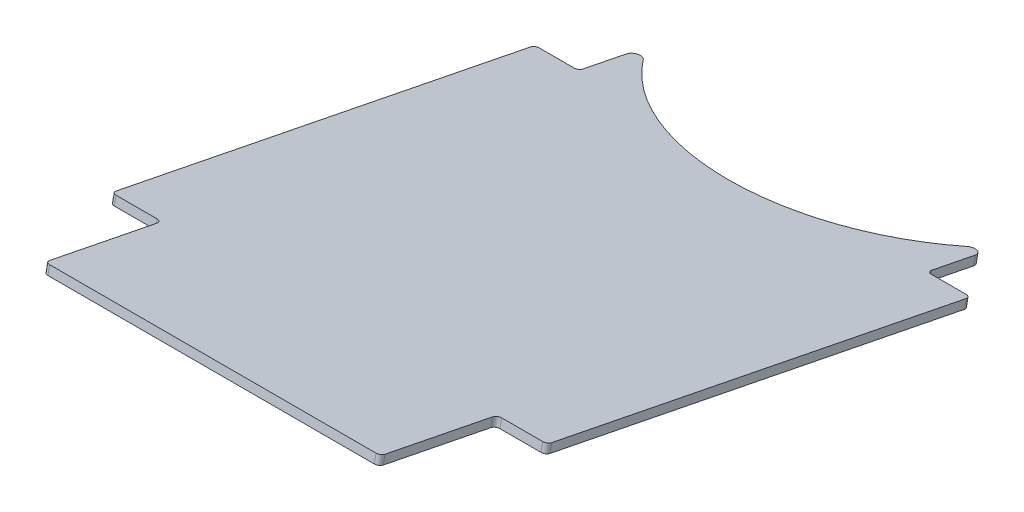
ISO-10303-21;
HEADER;
FILE_DESCRIPTION(('STEP AP214'),'2;1');
FILE_NAME('part.step','',(''),(''),'','','');
FILE_SCHEMA(('AUTOMOTIVE_DESIGN { 1 0 10303 214 1 1 1 1 }'));
ENDSEC;
DATA;
#1=APPLICATION_CONTEXT('core data for automotive mechanical design processes');
#2=APPLICATION_PROTOCOL_DEFINITION('international standard','automotive_design',2000,#1);
#3=PRODUCT_CONTEXT('',#1,'mechanical');
#4=PRODUCT('Part','Part','',(#3));
#5=PRODUCT_RELATED_PRODUCT_CATEGORY('part','',(#4));
#6=PRODUCT_DEFINITION_FORMATION('','',#4);
#7=PRODUCT_DEFINITION_CONTEXT('part definition',#1,'design');
#8=PRODUCT_DEFINITION('design','',#6,#7);
#9=PRODUCT_DEFINITION_SHAPE('','',#8);
#10=(LENGTH_UNIT() NAMED_UNIT(*) SI_UNIT(.MILLI.,.METRE.));
#11=(NAMED_UNIT(*) PLANE_ANGLE_UNIT() SI_UNIT($,.RADIAN.));
#12=(NAMED_UNIT(*) SI_UNIT($,.STERADIAN.) SOLID_ANGLE_UNIT());
#13=UNCERTAINTY_MEASURE_WITH_UNIT(LENGTH_MEASURE(1.E-05),#10,'distance_accuracy_value','');
#14=(GEOMETRIC_REPRESENTATION_CONTEXT(3) GLOBAL_UNCERTAINTY_ASSIGNED_CONTEXT((#13)) GLOBAL_UNIT_ASSIGNED_CONTEXT((#10,
#11,#12)) REPRESENTATION_CONTEXT('',''));
#15=CARTESIAN_POINT('',(0.,0.,0.));
#16=DIRECTION('',(0.,0.,1.));
#17=DIRECTION('',(1.,0.,0.));
#18=AXIS2_PLACEMENT_3D('',#15,#16,#17);
#19=CARTESIAN_POINT('',(317.5,38.1,0.));
#20=DIRECTION('',(0.,-0.980785280403232,0.195090322016121));
#21=DIRECTION('',(0.,-0.195090322016121,-0.980785280403232));
#22=AXIS2_PLACEMENT_3D('',#19,#20,#21);
#23=PLANE('',#22);
#24=DIRECTION('',(1.,0.,0.));
#25=VECTOR('',#24,1.);
#26=CARTESIAN_POINT('',(31.75,51.896948909235,69.3619461222421));
#27=LINE('',#26,#25);
#28=CARTESIAN_POINT('',(3.302,51.896948909235,69.3619461222421));
#29=VERTEX_POINT('',#28);
#30=CARTESIAN_POINT('',(28.448,51.896948909235,69.3619461222421));
#31=VERTEX_POINT('',#30);
#32=EDGE_CURVE('E338',#29,#31,#27,.T.);
#33=ORIENTED_EDGE('',*,*,#32,.F.);
#34=CARTESIAN_POINT('',(3.302,52.5411371525322,72.6004991181335));
#35=DIRECTION('',(0.,-0.980785280403232,0.195090322016121));
#36=DIRECTION('',(0.,-0.195090322016121,-0.980785280403232));
#37=AXIS2_PLACEMENT_3D('',#34,#35,#36);
#38=CIRCLE('',#37,3.302);
#39=CARTESIAN_POINT('',(0.,52.5411371525322,72.6004991181335));
#40=VERTEX_POINT('',#39);
#41=EDGE_CURVE('E285',#29,#40,#38,.F.);
#42=ORIENTED_EDGE('',*,*,#41,.T.);
#43=DIRECTION('',(0.,0.195090322016121,0.980785280403232));
#44=VECTOR('',#43,1.);
#45=CARTESIAN_POINT('',(0.,38.1,0.));
#46=LINE('',#45,#44);
#47=CARTESIAN_POINT('',(0.,112.622011955949,374.647453738828));
#48=VERTEX_POINT('',#47);
#49=EDGE_CURVE('E231',#40,#48,#46,.T.);
#50=ORIENTED_EDGE('',*,*,#49,.T.);
#51=CARTESIAN_POINT('',(3.302,112.622011955949,374.647453738828));
#52=DIRECTION('',(0.,-0.980785280403232,0.195090322016121));
#53=DIRECTION('',(0.,-0.195090322016121,-0.980785280403232));
#54=AXIS2_PLACEMENT_3D('',#51,#52,#53);
#55=CIRCLE('',#54,3.302);
#56=CARTESIAN_POINT('',(3.302,113.266200199246,377.88600673472));
#57=VERTEX_POINT('',#56);
#58=EDGE_CURVE('E283',#48,#57,#55,.F.);
#59=ORIENTED_EDGE('',*,*,#58,.T.);
#60=DIRECTION('',(-1.,0.,0.));
#61=VECTOR('',#60,1.);
#62=CARTESIAN_POINT('',(0.,113.266200199246,377.88600673472));
#63=LINE('',#62,#61);
#64=CARTESIAN_POINT('',(33.2105,113.266200199246,377.88600673472));
#65=VERTEX_POINT('',#64);
#66=EDGE_CURVE('E349',#65,#57,#63,.T.);
#67=ORIENTED_EDGE('',*,*,#66,.F.);
#68=CARTESIAN_POINT('',(33.2105,113.910388442543,381.124559730611));
#69=DIRECTION('',(0.,-0.980785280403232,0.195090322016121));
#70=DIRECTION('',(0.,-0.195090322016121,-0.980785280403232));
#71=AXIS2_PLACEMENT_3D('',#68,#69,#70);
#72=CIRCLE('',#71,3.302);
#73=CARTESIAN_POINT('',(36.5125,113.910388442543,381.124559730611));
#74=VERTEX_POINT('',#73);
#75=EDGE_CURVE('E325',#65,#74,#72,.T.);
#76=ORIENTED_EDGE('',*,*,#75,.T.);
#77=DIRECTION('',(0.,-0.195090322016121,-0.980785280403232));
#78=VECTOR('',#77,1.);
#79=CARTESIAN_POINT('',(36.5125,113.266200199246,377.88600673472));
#80=LINE('',#79,#78);
#81=CARTESIAN_POINT('',(36.5125,129.516019727189,459.579366187472));
#82=VERTEX_POINT('',#81);
#83=EDGE_CURVE('E406',#82,#74,#80,.T.);
#84=ORIENTED_EDGE('',*,*,#83,.F.);
#85=CARTESIAN_POINT('',(39.8145,129.516019727189,459.579366187472));
#86=DIRECTION('',(0.,-0.980785280403232,0.195090322016121));
#87=DIRECTION('',(0.,-0.195090322016121,-0.980785280403232));
#88=AXIS2_PLACEMENT_3D('',#85,#86,#87);
#89=CIRCLE('',#88,3.302);
#90=CARTESIAN_POINT('',(39.8145,130.160207970487,462.817919183363));
#91=VERTEX_POINT('',#90);
#92=EDGE_CURVE('E281',#82,#91,#89,.F.);
#93=ORIENTED_EDGE('',*,*,#92,.T.);
#94=DIRECTION('',(1.,0.,0.));
#95=VECTOR('',#94,1.);
#96=CARTESIAN_POINT('',(36.5125,130.160207970487,462.817919183363));
#97=LINE('',#96,#95);
#98=CARTESIAN_POINT('',(277.6855,130.160207970487,462.817919183363));
#99=VERTEX_POINT('',#98);
#100=EDGE_CURVE('E397',#91,#99,#97,.T.);
#101=ORIENTED_EDGE('',*,*,#100,.T.);
#102=CARTESIAN_POINT('',(277.6855,129.516019727189,459.579366187472));
#103=DIRECTION('',(0.,-0.980785280403232,0.195090322016121));
#104=DIRECTION('',(0.,-0.195090322016121,-0.980785280403232));
#105=AXIS2_PLACEMENT_3D('',#102,#103,#104);
#106=CIRCLE('',#105,3.302);
#107=CARTESIAN_POINT('',(280.9875,129.51601972719,459.579366187472));
#108=VERTEX_POINT('',#107);
#109=EDGE_CURVE('E279',#99,#108,#106,.F.);
#110=ORIENTED_EDGE('',*,*,#109,.T.);
#111=DIRECTION('',(0.,0.195090322016122,0.980785280403232));
#112=VECTOR('',#111,1.);
#113=CARTESIAN_POINT('',(280.9875,113.266200199246,377.88600673472));
#114=LINE('',#113,#112);
#115=CARTESIAN_POINT('',(280.9875,113.910388442543,381.124559730611));
#116=VERTEX_POINT('',#115);
#117=EDGE_CURVE('E392',#116,#108,#114,.T.);
#118=ORIENTED_EDGE('',*,*,#117,.F.);
#119=CARTESIAN_POINT('',(284.2895,113.910388442543,381.124559730611));
#120=DIRECTION('',(0.,-0.980785280403232,0.195090322016121));
#121=DIRECTION('',(0.,-0.195090322016121,-0.980785280403232));
#122=AXIS2_PLACEMENT_3D('',#119,#120,#121);
#123=CIRCLE('',#122,3.302);
#124=CARTESIAN_POINT('',(284.2895,113.266200199246,377.88600673472));
#125=VERTEX_POINT('',#124);
#126=EDGE_CURVE('E329',#116,#125,#123,.T.);
#127=ORIENTED_EDGE('',*,*,#126,.T.);
#128=DIRECTION('',(-1.,0.,0.));
#129=VECTOR('',#128,1.);
#130=CARTESIAN_POINT('',(317.5,113.266200199246,377.88600673472));
#131=LINE('',#130,#129);
#132=CARTESIAN_POINT('',(314.198,113.266200199246,377.88600673472));
#133=VERTEX_POINT('',#132);
#134=EDGE_CURVE('E391',#133,#125,#131,.T.);
#135=ORIENTED_EDGE('',*,*,#134,.F.);
#136=CARTESIAN_POINT('',(314.198,112.622011955949,374.647453738828));
#137=DIRECTION('',(0.,-0.980785280403232,0.195090322016121));
#138=DIRECTION('',(0.,-0.195090322016121,-0.980785280403232));
#139=AXIS2_PLACEMENT_3D('',#136,#137,#138);
#140=CIRCLE('',#139,3.302);
#141=CARTESIAN_POINT('',(317.5,112.622011955949,374.647453738828));
#142=VERTEX_POINT('',#141);
#143=EDGE_CURVE('E277',#133,#142,#140,.F.);
#144=ORIENTED_EDGE('',*,*,#143,.T.);
#145=DIRECTION('',(0.,0.195090322016121,0.980785280403232));
#146=VECTOR('',#145,1.);
#147=CARTESIAN_POINT('',(317.5,38.1,0.));
#148=LINE('',#147,#146);
#149=CARTESIAN_POINT('',(317.5,52.5411371525322,72.6004991181335));
#150=VERTEX_POINT('',#149);
#151=EDGE_CURVE('E365',#150,#142,#148,.T.);
#152=ORIENTED_EDGE('',*,*,#151,.F.);
#153=CARTESIAN_POINT('',(314.198,52.5411371525322,72.6004991181335));
#154=DIRECTION('',(0.,-0.980785280403232,0.195090322016121));
#155=DIRECTION('',(0.,-0.195090322016121,-0.980785280403232));
#156=AXIS2_PLACEMENT_3D('',#153,#154,#155);
#157=CIRCLE('',#156,3.302);
#158=CARTESIAN_POINT('',(314.198,51.896948909235,69.361946122242));
#159=VERTEX_POINT('',#158);
#160=EDGE_CURVE('E61',#150,#159,#157,.F.);
#161=ORIENTED_EDGE('',*,*,#160,.T.);
#162=DIRECTION('',(1.,0.,0.));
#163=VECTOR('',#162,1.);
#164=CARTESIAN_POINT('',(285.75,51.896948909235,69.3619461222421));
#165=LINE('',#164,#163);
#166=CARTESIAN_POINT('',(289.052,51.896948909235,69.3619461222421));
#167=VERTEX_POINT('',#166);
#168=EDGE_CURVE('E409',#167,#159,#165,.T.);
#169=ORIENTED_EDGE('',*,*,#168,.F.);
#170=CARTESIAN_POINT('',(289.052,51.2527606659377,66.1233931263506));
#171=DIRECTION('',(0.,-0.980785280403232,0.195090322016121));
#172=DIRECTION('',(0.,-0.195090322016121,-0.980785280403232));
#173=AXIS2_PLACEMENT_3D('',#170,#171,#172);
#174=CIRCLE('',#173,3.302);
#175=CARTESIAN_POINT('',(285.75,51.2527606659378,66.1233931263506));
#176=VERTEX_POINT('',#175);
#177=EDGE_CURVE('E69',#167,#176,#174,.T.);
#178=ORIENTED_EDGE('',*,*,#177,.T.);
#179=DIRECTION('',(0.,0.195090322016122,0.980785280403232));
#180=VECTOR('',#179,1.);
#181=CARTESIAN_POINT('',(285.75,38.1,0.));
#182=LINE('',#181,#180);
#183=CARTESIAN_POINT('',(285.75,44.922985203387,34.301462967179));
#184=VERTEX_POINT('',#183);
#185=EDGE_CURVE('E399',#184,#176,#182,.T.);
#186=ORIENTED_EDGE('',*,*,#185,.F.);
#187=CARTESIAN_POINT('',(280.67,44.922985203387,34.301462967179));
#188=DIRECTION('',(0.,-0.980785280403232,0.195090322016121));
#189=DIRECTION('',(0.,-0.195090322016121,-0.980785280403232));
#190=AXIS2_PLACEMENT_3D('',#187,#188,#189);
#191=CIRCLE('',#190,5.08);
#192=CARTESIAN_POINT('',(276.685982176012,44.3080946136842,31.2101992222294));
#193=VERTEX_POINT('',#192);
#194=EDGE_CURVE('E235',#184,#193,#191,.F.);
#195=ORIENTED_EDGE('',*,*,#194,.T.);
#196=CARTESIAN_POINT('',(158.75,26.105935679868,-60.2982332276995));
#197=DIRECTION('',(0.,-0.980785280403232,0.195090322016121));
#198=DIRECTION('',(0.,-0.195090322016121,-0.980785280403232));
#199=AXIS2_PLACEMENT_3D('',#196,#197,#198);
#200=CIRCLE('',#199,150.379545454545);
#201=CARTESIAN_POINT('',(40.8140178239881,44.3080946136842,31.2101992222294));
#202=VERTEX_POINT('',#201);
#203=EDGE_CURVE('E435',#193,#202,#200,.T.);
#204=ORIENTED_EDGE('',*,*,#203,.T.);
#205=CARTESIAN_POINT('',(36.83,44.922985203387,34.301462967179));
#206=DIRECTION('',(0.,-0.980785280403232,0.195090322016121));
#207=DIRECTION('',(0.,-0.195090322016121,-0.980785280403232));
#208=AXIS2_PLACEMENT_3D('',#205,#206,#207);
#209=CIRCLE('',#208,5.08);
#210=CARTESIAN_POINT('',(31.75,44.922985203387,34.301462967179));
#211=VERTEX_POINT('',#210);
#212=EDGE_CURVE('E236',#202,#211,#209,.F.);
#213=ORIENTED_EDGE('',*,*,#212,.T.);
#214=DIRECTION('',(0.,-0.195090322016122,-0.980785280403232));
#215=VECTOR('',#214,1.);
#216=CARTESIAN_POINT('',(31.7499999999999,38.1,0.));
#217=LINE('',#216,#215);
#218=CARTESIAN_POINT('',(31.75,51.2527606659378,66.1233931263506));
#219=VERTEX_POINT('',#218);
#220=EDGE_CURVE('E340',#219,#211,#217,.T.);
#221=ORIENTED_EDGE('',*,*,#220,.F.);
#222=CARTESIAN_POINT('',(28.448,51.2527606659377,66.1233931263506));
#223=DIRECTION('',(0.,-0.980785280403232,0.195090322016121));
#224=DIRECTION('',(0.,-0.195090322016121,-0.980785280403232));
#225=AXIS2_PLACEMENT_3D('',#222,#223,#224);
#226=CIRCLE('',#225,3.302);
#227=EDGE_CURVE('E54',#219,#31,#226,.T.);
#228=ORIENTED_EDGE('',*,*,#227,.T.);
#229=EDGE_LOOP('',(#33,#42,#50,#59,#67,#76,#84,#93,#101,#110,#118,#127,#135,#144,#152,#161,#169,
#178,#186,#195,#204,#213,#221,#228));
#230=FACE_BOUND('',#229,.T.);
#231=ADVANCED_FACE('F46',(#230),#23,.F.);
#232=CARTESIAN_POINT('',(317.5,31.8720134694395,1.23882354480237));
#233=DIRECTION('',(0.,0.980785280403232,-0.195090322016121));
#234=DIRECTION('',(0.,0.195090322016121,0.980785280403232));
#235=AXIS2_PLACEMENT_3D('',#232,#233,#234);
#236=PLANE('',#235);
#237=DIRECTION('',(0.,-0.195090322016121,-0.980785280403232));
#238=VECTOR('',#237,1.);
#239=CARTESIAN_POINT('',(0.,31.8720134694395,1.23882354480237));
#240=LINE('',#239,#238);
#241=CARTESIAN_POINT('',(0.,106.394025425388,375.886277283631));
#242=VERTEX_POINT('',#241);
#243=CARTESIAN_POINT('',(0.,46.3131506219717,73.8393226629359));
#244=VERTEX_POINT('',#243);
#245=EDGE_CURVE('E369',#242,#244,#240,.T.);
#246=ORIENTED_EDGE('',*,*,#245,.T.);
#247=CARTESIAN_POINT('',(3.302,46.3131506219717,73.8393226629359));
#248=DIRECTION('',(0.,0.980785280403232,-0.195090322016121));
#249=DIRECTION('',(0.,0.195090322016121,0.980785280403232));
#250=AXIS2_PLACEMENT_3D('',#247,#248,#249);
#251=CIRCLE('',#250,3.302);
#252=CARTESIAN_POINT('',(3.30200000000003,45.6689623786744,70.6007696670445));
#253=VERTEX_POINT('',#252);
#254=EDGE_CURVE('E270',#244,#253,#251,.F.);
#255=ORIENTED_EDGE('',*,*,#254,.T.);
#256=DIRECTION('',(1.,0.,0.));
#257=VECTOR('',#256,1.);
#258=CARTESIAN_POINT('',(317.5,45.6689623786745,70.6007696670446));
#259=LINE('',#258,#257);
#260=CARTESIAN_POINT('',(28.448,45.6689623786744,70.6007696670445));
#261=VERTEX_POINT('',#260);
#262=EDGE_CURVE('E354',#253,#261,#259,.T.);
#263=ORIENTED_EDGE('',*,*,#262,.T.);
#264=CARTESIAN_POINT('',(28.448,45.0247741353772,67.362216671153));
#265=DIRECTION('',(0.,0.980785280403232,-0.195090322016121));
#266=DIRECTION('',(0.,0.195090322016121,0.980785280403232));
#267=AXIS2_PLACEMENT_3D('',#264,#265,#266);
#268=CIRCLE('',#267,3.302);
#269=CARTESIAN_POINT('',(31.75,45.0247741353772,67.362216671153));
#270=VERTEX_POINT('',#269);
#271=EDGE_CURVE('E13',#261,#270,#268,.T.);
#272=ORIENTED_EDGE('',*,*,#271,.T.);
#273=DIRECTION('',(0.,-0.195090322016121,-0.980785280403232));
#274=VECTOR('',#273,1.);
#275=CARTESIAN_POINT('',(31.7499999999999,31.8720134694395,1.23882354480243));
#276=LINE('',#275,#274);
#277=CARTESIAN_POINT('',(31.75,38.6949986728265,35.5402865119814));
#278=VERTEX_POINT('',#277);
#279=EDGE_CURVE('E232',#270,#278,#276,.T.);
#280=ORIENTED_EDGE('',*,*,#279,.T.);
#281=CARTESIAN_POINT('',(36.83,38.6949986728265,35.5402865119814));
#282=DIRECTION('',(0.,0.980785280403232,-0.195090322016121));
#283=DIRECTION('',(0.,0.195090322016121,0.980785280403232));
#284=AXIS2_PLACEMENT_3D('',#281,#282,#283);
#285=CIRCLE('',#284,5.08);
#286=CARTESIAN_POINT('',(40.8140178239881,38.0801080831237,32.4490227670318));
#287=VERTEX_POINT('',#286);
#288=EDGE_CURVE('E222',#278,#287,#285,.F.);
#289=ORIENTED_EDGE('',*,*,#288,.T.);
#290=CARTESIAN_POINT('',(158.75,19.8779491493075,-59.0594096828972));
#291=DIRECTION('',(0.,-0.980785280403232,0.195090322016122));
#292=DIRECTION('',(0.,0.195090322016122,0.980785280403232));
#293=AXIS2_PLACEMENT_3D('',#290,#291,#292);
#294=CIRCLE('',#293,150.379545454545);
#295=CARTESIAN_POINT('',(276.685982176012,38.0801080831237,32.4490227670317));
#296=VERTEX_POINT('',#295);
#297=EDGE_CURVE('E217',#296,#287,#294,.T.);
#298=ORIENTED_EDGE('',*,*,#297,.F.);
#299=CARTESIAN_POINT('',(280.67,38.6949986728265,35.5402865119813));
#300=DIRECTION('',(0.,0.980785280403232,-0.195090322016121));
#301=DIRECTION('',(0.,0.195090322016121,0.980785280403232));
#302=AXIS2_PLACEMENT_3D('',#299,#300,#301);
#303=CIRCLE('',#302,5.08);
#304=CARTESIAN_POINT('',(285.75,38.6949986728265,35.5402865119814));
#305=VERTEX_POINT('',#304);
#306=EDGE_CURVE('E210',#296,#305,#303,.F.);
#307=ORIENTED_EDGE('',*,*,#306,.T.);
#308=DIRECTION('',(0.,0.195090322016121,0.980785280403232));
#309=VECTOR('',#308,1.);
#310=CARTESIAN_POINT('',(285.75,31.8720134694395,1.23882354480237));
#311=LINE('',#310,#309);
#312=CARTESIAN_POINT('',(285.75,45.0247741353772,67.362216671153));
#313=VERTEX_POINT('',#312);
#314=EDGE_CURVE('E214',#305,#313,#311,.T.);
#315=ORIENTED_EDGE('',*,*,#314,.T.);
#316=CARTESIAN_POINT('',(289.052,45.0247741353772,67.362216671153));
#317=DIRECTION('',(0.,0.980785280403232,-0.195090322016121));
#318=DIRECTION('',(0.,0.195090322016121,0.980785280403232));
#319=AXIS2_PLACEMENT_3D('',#316,#317,#318);
#320=CIRCLE('',#319,3.302);
#321=CARTESIAN_POINT('',(289.052,45.6689623786744,70.6007696670444));
#322=VERTEX_POINT('',#321);
#323=EDGE_CURVE('E334',#313,#322,#320,.T.);
#324=ORIENTED_EDGE('',*,*,#323,.T.);
#325=DIRECTION('',(1.,0.,0.));
#326=VECTOR('',#325,1.);
#327=CARTESIAN_POINT('',(317.5,45.6689623786744,70.6007696670444));
#328=LINE('',#327,#326);
#329=CARTESIAN_POINT('',(314.198,45.6689623786744,70.6007696670444));
#330=VERTEX_POINT('',#329);
#331=EDGE_CURVE('E358',#322,#330,#328,.T.);
#332=ORIENTED_EDGE('',*,*,#331,.T.);
#333=CARTESIAN_POINT('',(314.198,46.3131506219717,73.8393226629359));
#334=DIRECTION('',(0.,0.980785280403232,-0.195090322016121));
#335=DIRECTION('',(0.,0.195090322016121,0.980785280403232));
#336=AXIS2_PLACEMENT_3D('',#333,#334,#335);
#337=CIRCLE('',#336,3.302);
#338=CARTESIAN_POINT('',(317.5,46.3131506219717,73.8393226629359));
#339=VERTEX_POINT('',#338);
#340=EDGE_CURVE('E260',#330,#339,#337,.F.);
#341=ORIENTED_EDGE('',*,*,#340,.T.);
#342=DIRECTION('',(0.,-0.195090322016121,-0.980785280403232));
#343=VECTOR('',#342,1.);
#344=CARTESIAN_POINT('',(317.5,31.8720134694395,1.23882354480237));
#345=LINE('',#344,#343);
#346=CARTESIAN_POINT('',(317.5,106.394025425388,375.886277283631));
#347=VERTEX_POINT('',#346);
#348=EDGE_CURVE('E368',#347,#339,#345,.T.);
#349=ORIENTED_EDGE('',*,*,#348,.F.);
#350=CARTESIAN_POINT('',(314.198,106.394025425388,375.886277283631));
#351=DIRECTION('',(0.,0.980785280403232,-0.195090322016121));
#352=DIRECTION('',(0.,0.195090322016121,0.980785280403232));
#353=AXIS2_PLACEMENT_3D('',#350,#351,#352);
#354=CIRCLE('',#353,3.302);
#355=CARTESIAN_POINT('',(314.198,107.038213668685,379.124830279522));
#356=VERTEX_POINT('',#355);
#357=EDGE_CURVE('E262',#347,#356,#354,.F.);
#358=ORIENTED_EDGE('',*,*,#357,.T.);
#359=DIRECTION('',(-1.,0.,0.));
#360=VECTOR('',#359,1.);
#361=CARTESIAN_POINT('',(317.5,107.038213668685,379.124830279522));
#362=LINE('',#361,#360);
#363=CARTESIAN_POINT('',(284.2895,107.038213668685,379.124830279522));
#364=VERTEX_POINT('',#363);
#365=EDGE_CURVE('E361',#356,#364,#362,.T.);
#366=ORIENTED_EDGE('',*,*,#365,.T.);
#367=CARTESIAN_POINT('',(284.2895,107.682401911982,382.363383275414));
#368=DIRECTION('',(0.,0.980785280403232,-0.195090322016121));
#369=DIRECTION('',(0.,0.195090322016121,0.980785280403232));
#370=AXIS2_PLACEMENT_3D('',#367,#368,#369);
#371=CIRCLE('',#370,3.302);
#372=CARTESIAN_POINT('',(280.9875,107.682401911982,382.363383275414));
#373=VERTEX_POINT('',#372);
#374=EDGE_CURVE('E331',#364,#373,#371,.T.);
#375=ORIENTED_EDGE('',*,*,#374,.T.);
#376=DIRECTION('',(0.,0.195090322016121,0.980785280403232));
#377=VECTOR('',#376,1.);
#378=CARTESIAN_POINT('',(280.987499999999,31.8720134694395,1.23882354480241));
#379=LINE('',#378,#377);
#380=CARTESIAN_POINT('',(280.9875,123.288033196629,460.818189732274));
#381=VERTEX_POINT('',#380);
#382=EDGE_CURVE('E242',#373,#381,#379,.T.);
#383=ORIENTED_EDGE('',*,*,#382,.T.);
#384=CARTESIAN_POINT('',(277.6855,123.288033196629,460.818189732274));
#385=DIRECTION('',(0.,0.980785280403232,-0.195090322016121));
#386=DIRECTION('',(0.,0.195090322016121,0.980785280403232));
#387=AXIS2_PLACEMENT_3D('',#384,#385,#386);
#388=CIRCLE('',#387,3.302);
#389=CARTESIAN_POINT('',(277.6855,123.932221439926,464.056742728166));
#390=VERTEX_POINT('',#389);
#391=EDGE_CURVE('E264',#381,#390,#388,.F.);
#392=ORIENTED_EDGE('',*,*,#391,.T.);
#393=DIRECTION('',(-1.,0.,0.));
#394=VECTOR('',#393,1.);
#395=CARTESIAN_POINT('',(36.5125,123.932221439926,464.056742728166));
#396=LINE('',#395,#394);
#397=CARTESIAN_POINT('',(39.8145,123.932221439926,464.056742728166));
#398=VERTEX_POINT('',#397);
#399=EDGE_CURVE('E402',#390,#398,#396,.T.);
#400=ORIENTED_EDGE('',*,*,#399,.T.);
#401=CARTESIAN_POINT('',(39.8145,123.288033196629,460.818189732274));
#402=DIRECTION('',(0.,0.980785280403232,-0.195090322016121));
#403=DIRECTION('',(0.,0.195090322016121,0.980785280403232));
#404=AXIS2_PLACEMENT_3D('',#401,#402,#403);
#405=CIRCLE('',#404,3.302);
#406=CARTESIAN_POINT('',(36.5125,123.288033196629,460.818189732274));
#407=VERTEX_POINT('',#406);
#408=EDGE_CURVE('E266',#398,#407,#405,.F.);
#409=ORIENTED_EDGE('',*,*,#408,.T.);
#410=DIRECTION('',(0.,-0.195090322016121,-0.980785280403232));
#411=VECTOR('',#410,1.);
#412=CARTESIAN_POINT('',(36.5125,31.8720134694395,1.23882354480237));
#413=LINE('',#412,#411);
#414=CARTESIAN_POINT('',(36.5125,107.682401911982,382.363383275414));
#415=VERTEX_POINT('',#414);
#416=EDGE_CURVE('E237',#407,#415,#413,.T.);
#417=ORIENTED_EDGE('',*,*,#416,.T.);
#418=CARTESIAN_POINT('',(33.2105,107.682401911982,382.363383275414));
#419=DIRECTION('',(0.,0.980785280403232,-0.195090322016121));
#420=DIRECTION('',(0.,0.195090322016121,0.980785280403232));
#421=AXIS2_PLACEMENT_3D('',#418,#419,#420);
#422=CIRCLE('',#421,3.302);
#423=CARTESIAN_POINT('',(33.2105,107.038213668685,379.124830279522));
#424=VERTEX_POINT('',#423);
#425=EDGE_CURVE('E327',#415,#424,#422,.T.);
#426=ORIENTED_EDGE('',*,*,#425,.T.);
#427=DIRECTION('',(-1.,0.,0.));
#428=VECTOR('',#427,1.);
#429=CARTESIAN_POINT('',(317.5,107.038213668685,379.124830279522));
#430=LINE('',#429,#428);
#431=CARTESIAN_POINT('',(3.30200000000003,107.038213668685,379.124830279522));
#432=VERTEX_POINT('',#431);
#433=EDGE_CURVE('E416',#424,#432,#430,.T.);
#434=ORIENTED_EDGE('',*,*,#433,.T.);
#435=CARTESIAN_POINT('',(3.302,106.394025425388,375.886277283631));
#436=DIRECTION('',(0.,0.980785280403232,-0.195090322016121));
#437=DIRECTION('',(0.,0.195090322016121,0.980785280403232));
#438=AXIS2_PLACEMENT_3D('',#435,#436,#437);
#439=CIRCLE('',#438,3.302);
#440=EDGE_CURVE('E268',#432,#242,#439,.F.);
#441=ORIENTED_EDGE('',*,*,#440,.T.);
#442=EDGE_LOOP('',(#246,#255,#263,#272,#280,#289,#298,#307,#315,#324,#332,#341,#349,#358,#366,
#375,#383,#392,#400,#409,#417,#426,#434,#441));
#443=FACE_BOUND('',#442,.T.);
#444=ADVANCED_FACE('F213',(#443),#236,.F.);
#445=CARTESIAN_POINT('',(317.5,0.,0.));
#446=DIRECTION('',(1.,0.,0.));
#447=DIRECTION('',(0.,0.,-1.));
#448=AXIS2_PLACEMENT_3D('',#445,#446,#447);
#449=PLANE('',#448);
#450=ORIENTED_EDGE('',*,*,#151,.T.);
#451=DIRECTION('',(0.,0.980785280403232,-0.195090322016121));
#452=VECTOR('',#451,1.);
#453=CARTESIAN_POINT('',(317.5,106.394025425388,375.886277283631));
#454=LINE('',#453,#452);
#455=EDGE_CURVE('E314',#142,#347,#454,.F.);
#456=ORIENTED_EDGE('',*,*,#455,.T.);
#457=ORIENTED_EDGE('',*,*,#348,.T.);
#458=DIRECTION('',(0.,-0.980785280403232,0.195090322016121));
#459=VECTOR('',#458,1.);
#460=CARTESIAN_POINT('',(317.5,52.5411371525322,72.6004991181335));
#461=LINE('',#460,#459);
#462=EDGE_CURVE('E312',#339,#150,#461,.F.);
#463=ORIENTED_EDGE('',*,*,#462,.T.);
#464=EDGE_LOOP('',(#450,#456,#457,#463));
#465=FACE_BOUND('',#464,.T.);
#466=ADVANCED_FACE('F424',(#465),#449,.T.);
#467=CARTESIAN_POINT('',(0.,0.,0.));
#468=DIRECTION('',(1.,0.,0.));
#469=DIRECTION('',(0.,0.,-1.));
#470=AXIS2_PLACEMENT_3D('',#467,#468,#469);
#471=PLANE('',#470);
#472=ORIENTED_EDGE('',*,*,#49,.F.);
#473=DIRECTION('',(0.,-0.980785280403232,0.195090322016121));
#474=VECTOR('',#473,1.);
#475=CARTESIAN_POINT('',(0.,15.8912320581921,79.8906185046882));
#476=LINE('',#475,#474);
#477=EDGE_CURVE('E257',#40,#244,#476,.T.);
#478=ORIENTED_EDGE('',*,*,#477,.T.);
#479=ORIENTED_EDGE('',*,*,#245,.F.);
#480=DIRECTION('',(0.,0.980785280403232,-0.195090322016121));
#481=VECTOR('',#480,1.);
#482=CARTESIAN_POINT('',(0.,75.9721068616084,381.937573125383));
#483=LINE('',#482,#481);
#484=EDGE_CURVE('E254',#242,#48,#483,.T.);
#485=ORIENTED_EDGE('',*,*,#484,.T.);
#486=EDGE_LOOP('',(#472,#478,#479,#485));
#487=FACE_BOUND('',#486,.T.);
#488=ADVANCED_FACE('F462',(#487),#471,.F.);
#489=CARTESIAN_POINT('',(31.7499999999999,-49.5343196804215,17.4315499913378));
#490=DIRECTION('',(1.,0.,0.));
#491=DIRECTION('',(0.,0.,-1.));
#492=AXIS2_PLACEMENT_3D('',#489,#490,#491);
#493=PLANE('',#492);
#494=ORIENTED_EDGE('',*,*,#279,.F.);
#495=DIRECTION('',(0.,0.980785280403232,-0.195090322016121));
#496=VECTOR('',#495,1.);
#497=CARTESIAN_POINT('',(31.75,51.2527606659378,66.1233931263506));
#498=LINE('',#497,#496);
#499=EDGE_CURVE('E322',#270,#219,#498,.T.);
#500=ORIENTED_EDGE('',*,*,#499,.T.);
#501=ORIENTED_EDGE('',*,*,#220,.T.);
#502=DIRECTION('',(0.,-0.980785280403232,0.195090322016122));
#503=VECTOR('',#502,1.);
#504=CARTESIAN_POINT('',(31.75,-42.7113344770345,51.7330129585168));
#505=LINE('',#504,#503);
#506=EDGE_CURVE('E221',#211,#278,#505,.T.);
#507=ORIENTED_EDGE('',*,*,#506,.T.);
#508=EDGE_LOOP('',(#494,#500,#501,#507));
#509=FACE_BOUND('',#508,.T.);
#510=ADVANCED_FACE('F356',(#509),#493,.F.);
#511=CARTESIAN_POINT('',(31.75,-35.7373707711866,86.7934961135799));
#512=DIRECTION('',(0.,0.195090322016121,0.980785280403232));
#513=DIRECTION('',(0.,-0.980785280403232,0.195090322016121));
#514=AXIS2_PLACEMENT_3D('',#511,#512,#513);
#515=PLANE('',#514);
#516=ORIENTED_EDGE('',*,*,#262,.F.);
#517=DIRECTION('',(0.,-0.980785280403232,0.195090322016121));
#518=VECTOR('',#517,1.);
#519=CARTESIAN_POINT('',(3.302,-35.7373707711866,86.7934961135798));
#520=LINE('',#519,#518);
#521=EDGE_CURVE('E274',#253,#29,#520,.F.);
#522=ORIENTED_EDGE('',*,*,#521,.T.);
#523=ORIENTED_EDGE('',*,*,#32,.T.);
#524=DIRECTION('',(0.,0.980785280403232,-0.195090322016121));
#525=VECTOR('',#524,1.);
#526=CARTESIAN_POINT('',(28.448,45.6689623786745,70.6007696670445));
#527=LINE('',#526,#525);
#528=EDGE_CURVE('E272',#31,#261,#527,.F.);
#529=ORIENTED_EDGE('',*,*,#528,.T.);
#530=EDGE_LOOP('',(#516,#522,#523,#529));
#531=FACE_BOUND('',#530,.T.);
#532=ADVANCED_FACE('F346',(#531),#515,.F.);
#533=CARTESIAN_POINT('',(36.5125,25.6318805188243,395.317556726058));
#534=DIRECTION('',(1.,0.,0.));
#535=DIRECTION('',(0.,0.,-1.));
#536=AXIS2_PLACEMENT_3D('',#533,#534,#535);
#537=PLANE('',#536);
#538=ORIENTED_EDGE('',*,*,#416,.F.);
#539=DIRECTION('',(0.,-0.980785280403232,0.195090322016122));
#540=VECTOR('',#539,1.);
#541=CARTESIAN_POINT('',(36.5125,129.516019727189,459.579366187472));
#542=LINE('',#541,#540);
#543=EDGE_CURVE('E299',#407,#82,#542,.F.);
#544=ORIENTED_EDGE('',*,*,#543,.T.);
#545=ORIENTED_EDGE('',*,*,#83,.T.);
#546=DIRECTION('',(0.,0.980785280403232,-0.195090322016121));
#547=VECTOR('',#546,1.);
#548=CARTESIAN_POINT('',(36.5125,107.682401911982,382.363383275414));
#549=LINE('',#548,#547);
#550=EDGE_CURVE('E297',#74,#415,#549,.F.);
#551=ORIENTED_EDGE('',*,*,#550,.T.);
#552=EDGE_LOOP('',(#538,#544,#545,#551));
#553=FACE_BOUND('',#552,.T.);
#554=ADVANCED_FACE('F470',(#553),#537,.F.);
#555=CARTESIAN_POINT('',(0.,25.6318805188243,395.317556726058));
#556=DIRECTION('',(0.,-0.195090322016121,-0.980785280403232));
#557=DIRECTION('',(0.,0.980785280403232,-0.195090322016121));
#558=AXIS2_PLACEMENT_3D('',#555,#556,#557);
#559=PLANE('',#558);
#560=ORIENTED_EDGE('',*,*,#66,.T.);
#561=DIRECTION('',(0.,0.980785280403232,-0.195090322016121));
#562=VECTOR('',#561,1.);
#563=CARTESIAN_POINT('',(3.302,25.6318805188243,395.317556726058));
#564=LINE('',#563,#562);
#565=EDGE_CURVE('E290',#57,#432,#564,.F.);
#566=ORIENTED_EDGE('',*,*,#565,.T.);
#567=ORIENTED_EDGE('',*,*,#433,.F.);
#568=DIRECTION('',(0.,0.980785280403232,-0.195090322016121));
#569=VECTOR('',#568,1.);
#570=CARTESIAN_POINT('',(33.2105,113.266200199246,377.88600673472));
#571=LINE('',#570,#569);
#572=EDGE_CURVE('E287',#424,#65,#571,.T.);
#573=ORIENTED_EDGE('',*,*,#572,.T.);
#574=EDGE_LOOP('',(#560,#566,#567,#573));
#575=FACE_BOUND('',#574,.T.);
#576=ADVANCED_FACE('F480',(#575),#559,.F.);
#577=CARTESIAN_POINT('',(280.9875,25.6318805188242,395.317556726058));
#578=DIRECTION('',(-1.,0.,0.));
#579=DIRECTION('',(0.,0.,1.));
#580=AXIS2_PLACEMENT_3D('',#577,#578,#579);
#581=PLANE('',#580);
#582=ORIENTED_EDGE('',*,*,#117,.T.);
#583=DIRECTION('',(0.,-0.980785280403232,0.195090322016122));
#584=VECTOR('',#583,1.);
#585=CARTESIAN_POINT('',(280.9875,123.288033196629,460.818189732274));
#586=LINE('',#585,#584);
#587=EDGE_CURVE('E304',#108,#381,#586,.T.);
#588=ORIENTED_EDGE('',*,*,#587,.T.);
#589=ORIENTED_EDGE('',*,*,#382,.F.);
#590=DIRECTION('',(0.,0.980785280403232,-0.195090322016121));
#591=VECTOR('',#590,1.);
#592=CARTESIAN_POINT('',(280.9875,113.910388442543,381.124559730611));
#593=LINE('',#592,#591);
#594=EDGE_CURVE('E301',#373,#116,#593,.T.);
#595=ORIENTED_EDGE('',*,*,#594,.T.);
#596=EDGE_LOOP('',(#582,#588,#589,#595));
#597=FACE_BOUND('',#596,.T.);
#598=ADVANCED_FACE('F383',(#597),#581,.F.);
#599=CARTESIAN_POINT('',(317.5,25.6318805188242,395.317556726058));
#600=DIRECTION('',(0.,-0.195090322016121,-0.980785280403232));
#601=DIRECTION('',(0.,0.980785280403232,-0.195090322016121));
#602=AXIS2_PLACEMENT_3D('',#599,#600,#601);
#603=PLANE('',#602);
#604=ORIENTED_EDGE('',*,*,#365,.F.);
#605=DIRECTION('',(0.,0.980785280403232,-0.195090322016121));
#606=VECTOR('',#605,1.);
#607=CARTESIAN_POINT('',(314.198,113.266200199246,377.88600673472));
#608=LINE('',#607,#606);
#609=EDGE_CURVE('E309',#356,#133,#608,.T.);
#610=ORIENTED_EDGE('',*,*,#609,.T.);
#611=ORIENTED_EDGE('',*,*,#134,.T.);
#612=DIRECTION('',(0.,0.980785280403232,-0.195090322016121));
#613=VECTOR('',#612,1.);
#614=CARTESIAN_POINT('',(284.2895,107.038213668685,379.124830279522));
#615=LINE('',#614,#613);
#616=EDGE_CURVE('E307',#125,#364,#615,.F.);
#617=ORIENTED_EDGE('',*,*,#616,.T.);
#618=EDGE_LOOP('',(#604,#610,#611,#617));
#619=FACE_BOUND('',#618,.T.);
#620=ADVANCED_FACE('F395',(#619),#603,.F.);
#621=CARTESIAN_POINT('',(285.75,-49.5343196804215,17.4315499913378));
#622=DIRECTION('',(-1.,0.,0.));
#623=DIRECTION('',(0.,0.,1.));
#624=AXIS2_PLACEMENT_3D('',#621,#622,#623);
#625=PLANE('',#624);
#626=ORIENTED_EDGE('',*,*,#185,.T.);
#627=DIRECTION('',(0.,0.980785280403232,-0.195090322016121));
#628=VECTOR('',#627,1.);
#629=CARTESIAN_POINT('',(285.75,45.0247741353772,67.362216671153));
#630=LINE('',#629,#628);
#631=EDGE_CURVE('E230',#176,#313,#630,.F.);
#632=ORIENTED_EDGE('',*,*,#631,.T.);
#633=ORIENTED_EDGE('',*,*,#314,.F.);
#634=DIRECTION('',(0.,-0.980785280403232,0.195090322016122));
#635=VECTOR('',#634,1.);
#636=CARTESIAN_POINT('',(285.75,-42.7113344770345,51.7330129585168));
#637=LINE('',#636,#635);
#638=EDGE_CURVE('E228',#305,#184,#637,.F.);
#639=ORIENTED_EDGE('',*,*,#638,.T.);
#640=EDGE_LOOP('',(#626,#632,#633,#639));
#641=FACE_BOUND('',#640,.T.);
#642=ADVANCED_FACE('F227',(#641),#625,.F.);
#643=CARTESIAN_POINT('',(285.75,-35.7373707711866,86.7934961135798));
#644=DIRECTION('',(0.,0.195090322016121,0.980785280403232));
#645=DIRECTION('',(0.,-0.980785280403232,0.195090322016121));
#646=AXIS2_PLACEMENT_3D('',#643,#644,#645);
#647=PLANE('',#646);
#648=ORIENTED_EDGE('',*,*,#168,.T.);
#649=DIRECTION('',(0.,-0.980785280403232,0.195090322016121));
#650=VECTOR('',#649,1.);
#651=CARTESIAN_POINT('',(314.198,45.6689623786745,70.6007696670444));
#652=LINE('',#651,#650);
#653=EDGE_CURVE('E318',#159,#330,#652,.T.);
#654=ORIENTED_EDGE('',*,*,#653,.T.);
#655=ORIENTED_EDGE('',*,*,#331,.F.);
#656=DIRECTION('',(0.,0.980785280403232,-0.195090322016121));
#657=VECTOR('',#656,1.);
#658=CARTESIAN_POINT('',(289.052,51.896948909235,69.3619461222421));
#659=LINE('',#658,#657);
#660=EDGE_CURVE('E316',#322,#167,#659,.T.);
#661=ORIENTED_EDGE('',*,*,#660,.T.);
#662=EDGE_LOOP('',(#648,#654,#655,#661));
#663=FACE_BOUND('',#662,.T.);
#664=ADVANCED_FACE('F431',(#663),#647,.F.);
#665=CARTESIAN_POINT('',(36.5125,372.83200687462,414.547497167064));
#666=DIRECTION('',(0.,0.195090322016122,0.980785280403232));
#667=DIRECTION('',(0.,-0.980785280403232,0.195090322016122));
#668=AXIS2_PLACEMENT_3D('',#665,#666,#667);
#669=PLANE('',#668);
#670=ORIENTED_EDGE('',*,*,#100,.F.);
#671=DIRECTION('',(0.,-0.980785280403232,0.195090322016122));
#672=VECTOR('',#671,1.);
#673=CARTESIAN_POINT('',(39.8145,123.932221439926,464.056742728166));
#674=LINE('',#673,#672);
#675=EDGE_CURVE('E294',#91,#398,#674,.T.);
#676=ORIENTED_EDGE('',*,*,#675,.T.);
#677=ORIENTED_EDGE('',*,*,#399,.F.);
#678=DIRECTION('',(0.,-0.980785280403232,0.195090322016122));
#679=VECTOR('',#678,1.);
#680=CARTESIAN_POINT('',(277.6855,130.160207970487,462.817919183363));
#681=LINE('',#680,#679);
#682=EDGE_CURVE('E292',#390,#99,#681,.F.);
#683=ORIENTED_EDGE('',*,*,#682,.T.);
#684=EDGE_LOOP('',(#670,#676,#677,#683));
#685=FACE_BOUND('',#684,.T.);
#686=ADVANCED_FACE('F477',(#685),#669,.T.);
#687=CARTESIAN_POINT('',(158.75,114.662310616444,-77.9131914128939));
#688=DIRECTION('',(0.,-0.980785280403232,0.195090322016122));
#689=DIRECTION('',(0.,-0.195090322016122,-0.980785280403232));
#690=AXIS2_PLACEMENT_3D('',#687,#688,#689);
#691=CYLINDRICAL_SURFACE('',#690,150.379545454545);
#692=ORIENTED_EDGE('',*,*,#203,.F.);
#693=DIRECTION('',(0.,-0.980785280403232,0.195090322016122));
#694=VECTOR('',#693,1.);
#695=CARTESIAN_POINT('',(276.685982176012,132.86446955026,13.595241037035));
#696=LINE('',#695,#694);
#697=EDGE_CURVE('E249',#193,#296,#696,.T.);
#698=ORIENTED_EDGE('',*,*,#697,.T.);
#699=ORIENTED_EDGE('',*,*,#297,.T.);
#700=DIRECTION('',(0.,-0.980785280403232,0.195090322016122));
#701=VECTOR('',#700,1.);
#702=CARTESIAN_POINT('',(40.8140178239881,132.86446955026,13.5952410370351));
#703=LINE('',#702,#701);
#704=EDGE_CURVE('E247',#287,#202,#703,.F.);
#705=ORIENTED_EDGE('',*,*,#704,.T.);
#706=EDGE_LOOP('',(#692,#698,#699,#705));
#707=FACE_BOUND('',#706,.T.);
#708=ADVANCED_FACE('F438',(#707),#691,.F.);
#709=CARTESIAN_POINT('',(280.67,133.479360139963,16.6865047819846));
#710=DIRECTION('',(0.,-0.980785280403232,0.195090322016122));
#711=DIRECTION('',(0.,-0.195090322016122,-0.980785280403232));
#712=AXIS2_PLACEMENT_3D('',#709,#710,#711);
#713=CYLINDRICAL_SURFACE('',#712,5.08);
#714=ORIENTED_EDGE('',*,*,#306,.F.);
#715=ORIENTED_EDGE('',*,*,#697,.F.);
#716=ORIENTED_EDGE('',*,*,#194,.F.);
#717=ORIENTED_EDGE('',*,*,#638,.F.);
#718=EDGE_LOOP('',(#714,#715,#716,#717));
#719=FACE_BOUND('',#718,.T.);
#720=ADVANCED_FACE('F234',(#719),#713,.T.);
#721=CARTESIAN_POINT('',(36.83,133.479360139963,16.6865047819847));
#722=DIRECTION('',(0.,-0.980785280403232,0.195090322016122));
#723=DIRECTION('',(0.,-0.195090322016122,-0.980785280403232));
#724=AXIS2_PLACEMENT_3D('',#721,#722,#723);
#725=CYLINDRICAL_SURFACE('',#724,5.08);
#726=ORIENTED_EDGE('',*,*,#212,.F.);
#727=ORIENTED_EDGE('',*,*,#704,.F.);
#728=ORIENTED_EDGE('',*,*,#288,.F.);
#729=ORIENTED_EDGE('',*,*,#506,.F.);
#730=EDGE_LOOP('',(#726,#727,#728,#729));
#731=FACE_BOUND('',#730,.T.);
#732=ADVANCED_FACE('F443',(#731),#725,.T.);
#733=CARTESIAN_POINT('',(3.302,15.8912320581921,79.8906185046883));
#734=DIRECTION('',(0.,-0.980785280403232,0.195090322016121));
#735=DIRECTION('',(0.,-0.195090322016121,-0.980785280403232));
#736=AXIS2_PLACEMENT_3D('',#733,#734,#735);
#737=CYLINDRICAL_SURFACE('',#736,3.302);
#738=ORIENTED_EDGE('',*,*,#41,.F.);
#739=ORIENTED_EDGE('',*,*,#521,.F.);
#740=ORIENTED_EDGE('',*,*,#254,.F.);
#741=ORIENTED_EDGE('',*,*,#477,.F.);
#742=EDGE_LOOP('',(#738,#739,#740,#741));
#743=FACE_BOUND('',#742,.T.);
#744=ADVANCED_FACE('F445',(#743),#737,.T.);
#745=CARTESIAN_POINT('',(3.302,75.9721068616084,381.937573125383));
#746=DIRECTION('',(0.,0.980785280403232,-0.195090322016121));
#747=DIRECTION('',(0.,0.195090322016121,0.980785280403232));
#748=AXIS2_PLACEMENT_3D('',#745,#746,#747);
#749=CYLINDRICAL_SURFACE('',#748,3.302);
#750=ORIENTED_EDGE('',*,*,#440,.F.);
#751=ORIENTED_EDGE('',*,*,#565,.F.);
#752=ORIENTED_EDGE('',*,*,#58,.F.);
#753=ORIENTED_EDGE('',*,*,#484,.F.);
#754=EDGE_LOOP('',(#750,#751,#752,#753));
#755=FACE_BOUND('',#754,.T.);
#756=ADVANCED_FACE('F451',(#755),#749,.T.);
#757=CARTESIAN_POINT('',(39.8145,372.187818631323,411.308944171172));
#758=DIRECTION('',(0.,0.980785280403232,-0.195090322016122));
#759=DIRECTION('',(0.,0.195090322016122,0.980785280403232));
#760=AXIS2_PLACEMENT_3D('',#757,#758,#759);
#761=CYLINDRICAL_SURFACE('',#760,3.302);
#762=ORIENTED_EDGE('',*,*,#92,.F.);
#763=ORIENTED_EDGE('',*,*,#543,.F.);
#764=ORIENTED_EDGE('',*,*,#408,.F.);
#765=ORIENTED_EDGE('',*,*,#675,.F.);
#766=EDGE_LOOP('',(#762,#763,#764,#765));
#767=FACE_BOUND('',#766,.T.);
#768=ADVANCED_FACE('F522',(#767),#761,.T.);
#769=CARTESIAN_POINT('',(277.6855,41.8817000467679,477.01091617881));
#770=DIRECTION('',(0.,0.980785280403232,-0.195090322016122));
#771=DIRECTION('',(0.,0.195090322016122,0.980785280403232));
#772=AXIS2_PLACEMENT_3D('',#769,#770,#771);
#773=CYLINDRICAL_SURFACE('',#772,3.302);
#774=ORIENTED_EDGE('',*,*,#109,.F.);
#775=ORIENTED_EDGE('',*,*,#682,.F.);
#776=ORIENTED_EDGE('',*,*,#391,.F.);
#777=ORIENTED_EDGE('',*,*,#587,.F.);
#778=EDGE_LOOP('',(#774,#775,#776,#777));
#779=FACE_BOUND('',#778,.T.);
#780=ADVANCED_FACE('F531',(#779),#773,.T.);
#781=CARTESIAN_POINT('',(314.198,24.987692275527,392.079003730166));
#782=DIRECTION('',(0.,-0.980785280403232,0.195090322016121));
#783=DIRECTION('',(0.,-0.195090322016121,-0.980785280403232));
#784=AXIS2_PLACEMENT_3D('',#781,#782,#783);
#785=CYLINDRICAL_SURFACE('',#784,3.302);
#786=ORIENTED_EDGE('',*,*,#357,.F.);
#787=ORIENTED_EDGE('',*,*,#455,.F.);
#788=ORIENTED_EDGE('',*,*,#143,.F.);
#789=ORIENTED_EDGE('',*,*,#609,.F.);
#790=EDGE_LOOP('',(#786,#787,#788,#789));
#791=FACE_BOUND('',#790,.T.);
#792=ADVANCED_FACE('F421',(#791),#785,.T.);
#793=CARTESIAN_POINT('',(314.198,-35.0931825278894,90.0320491094713));
#794=DIRECTION('',(0.,0.980785280403232,-0.195090322016121));
#795=DIRECTION('',(0.,0.195090322016121,0.980785280403232));
#796=AXIS2_PLACEMENT_3D('',#793,#794,#795);
#797=CYLINDRICAL_SURFACE('',#796,3.302);
#798=ORIENTED_EDGE('',*,*,#160,.F.);
#799=ORIENTED_EDGE('',*,*,#462,.F.);
#800=ORIENTED_EDGE('',*,*,#340,.F.);
#801=ORIENTED_EDGE('',*,*,#653,.F.);
#802=EDGE_LOOP('',(#798,#799,#800,#801));
#803=FACE_BOUND('',#802,.T.);
#804=ADVANCED_FACE('F427',(#803),#797,.T.);
#805=CARTESIAN_POINT('',(33.2105,26.2760687621215,398.556109721949));
#806=DIRECTION('',(0.,-0.980785280403232,0.195090322016121));
#807=DIRECTION('',(0.,-0.195090322016121,-0.980785280403232));
#808=AXIS2_PLACEMENT_3D('',#805,#806,#807);
#809=CYLINDRICAL_SURFACE('',#808,3.302);
#810=ORIENTED_EDGE('',*,*,#425,.F.);
#811=ORIENTED_EDGE('',*,*,#550,.F.);
#812=ORIENTED_EDGE('',*,*,#75,.F.);
#813=ORIENTED_EDGE('',*,*,#572,.F.);
#814=EDGE_LOOP('',(#810,#811,#812,#813));
#815=FACE_BOUND('',#814,.T.);
#816=ADVANCED_FACE('F555',(#815),#809,.F.);
#817=CARTESIAN_POINT('',(284.2895,26.2760687621215,398.556109721949));
#818=DIRECTION('',(0.,-0.980785280403232,0.195090322016121));
#819=DIRECTION('',(0.,-0.195090322016121,-0.980785280403232));
#820=AXIS2_PLACEMENT_3D('',#817,#818,#819);
#821=CYLINDRICAL_SURFACE('',#820,3.302);
#822=ORIENTED_EDGE('',*,*,#374,.F.);
#823=ORIENTED_EDGE('',*,*,#616,.F.);
#824=ORIENTED_EDGE('',*,*,#126,.F.);
#825=ORIENTED_EDGE('',*,*,#594,.F.);
#826=EDGE_LOOP('',(#822,#823,#824,#825));
#827=FACE_BOUND('',#826,.T.);
#828=ADVANCED_FACE('F387',(#827),#821,.F.);
#829=CARTESIAN_POINT('',(289.052,-36.3815590144838,83.5549431176884));
#830=DIRECTION('',(0.,-0.980785280403232,0.195090322016121));
#831=DIRECTION('',(0.,-0.195090322016121,-0.980785280403232));
#832=AXIS2_PLACEMENT_3D('',#829,#830,#831);
#833=CYLINDRICAL_SURFACE('',#832,3.302);
#834=ORIENTED_EDGE('',*,*,#323,.F.);
#835=ORIENTED_EDGE('',*,*,#631,.F.);
#836=ORIENTED_EDGE('',*,*,#177,.F.);
#837=ORIENTED_EDGE('',*,*,#660,.F.);
#838=EDGE_LOOP('',(#834,#835,#836,#837));
#839=FACE_BOUND('',#838,.T.);
#840=ADVANCED_FACE('F432',(#839),#833,.F.);
#841=CARTESIAN_POINT('',(28.448,-36.3815590144838,83.5549431176884));
#842=DIRECTION('',(0.,-0.980785280403232,0.195090322016121));
#843=DIRECTION('',(0.,-0.195090322016121,-0.980785280403232));
#844=AXIS2_PLACEMENT_3D('',#841,#842,#843);
#845=CYLINDRICAL_SURFACE('',#844,3.302);
#846=ORIENTED_EDGE('',*,*,#271,.F.);
#847=ORIENTED_EDGE('',*,*,#528,.F.);
#848=ORIENTED_EDGE('',*,*,#227,.F.);
#849=ORIENTED_EDGE('',*,*,#499,.F.);
#850=EDGE_LOOP('',(#846,#847,#848,#849));
#851=FACE_BOUND('',#850,.T.);
#852=ADVANCED_FACE('F48',(#851),#845,.F.);
#853=CLOSED_SHELL('',(#231,#444,#466,#488,#510,#532,#554,#576,#598,#620,#642,#664,#686,#708,
#720,#732,#744,#756,#768,#780,#792,#804,#816,#828,#840,#852));
#854=MANIFOLD_SOLID_BREP('B2',#853);
#855=ADVANCED_BREP_SHAPE_REPRESENTATION('',(#18,#854),#14);
#856=SHAPE_DEFINITION_REPRESENTATION(#9,#855);
ENDSEC;
END-ISO-10303-21;
